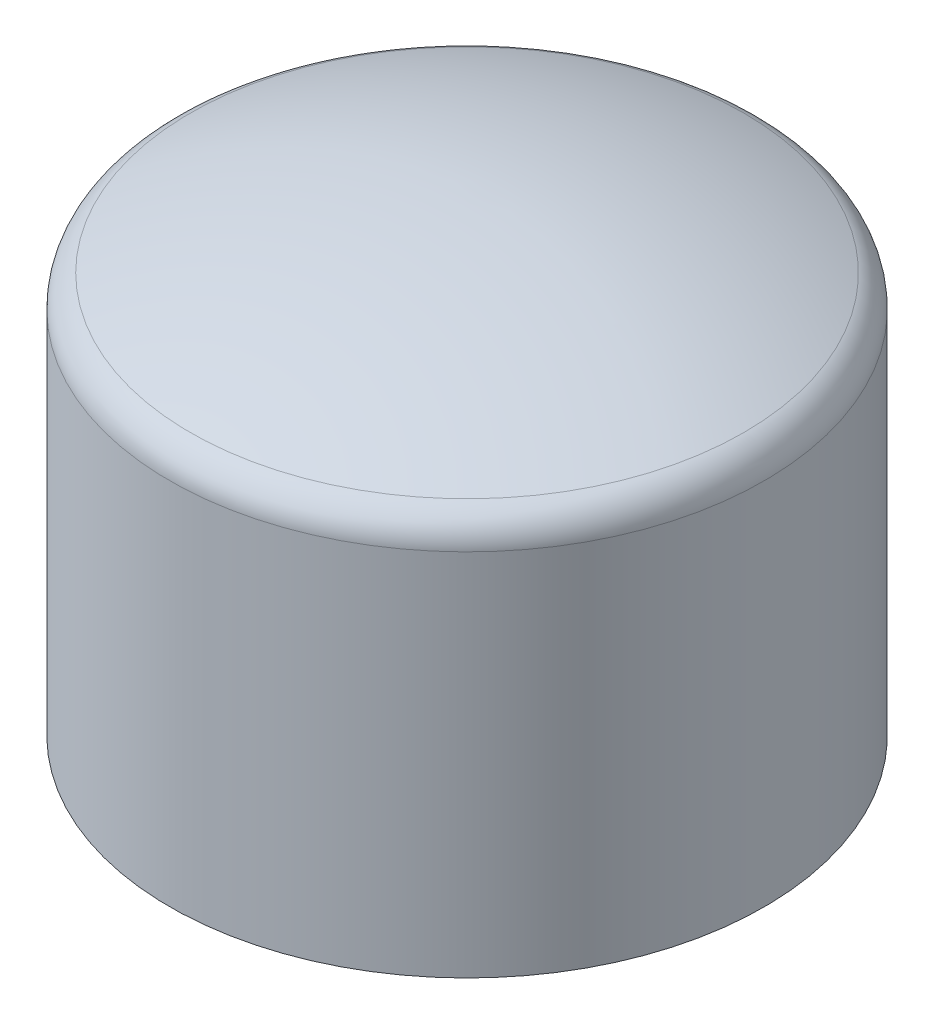
ISO-10303-21;
HEADER;
FILE_DESCRIPTION(('STEP AP214'),'2;1');
FILE_NAME('part.step','',(''),(''),'','','');
FILE_SCHEMA(('AUTOMOTIVE_DESIGN { 1 0 10303 214 1 1 1 1 }'));
ENDSEC;
DATA;
#1=APPLICATION_CONTEXT('core data for automotive mechanical design processes');
#2=APPLICATION_PROTOCOL_DEFINITION('international standard','automotive_design',2000,#1);
#3=PRODUCT_CONTEXT('',#1,'mechanical');
#4=PRODUCT('Part','Part','',(#3));
#5=PRODUCT_RELATED_PRODUCT_CATEGORY('part','',(#4));
#6=PRODUCT_DEFINITION_FORMATION('','',#4);
#7=PRODUCT_DEFINITION_CONTEXT('part definition',#1,'design');
#8=PRODUCT_DEFINITION('design','',#6,#7);
#9=PRODUCT_DEFINITION_SHAPE('','',#8);
#10=(LENGTH_UNIT() NAMED_UNIT(*) SI_UNIT(.MILLI.,.METRE.));
#11=(NAMED_UNIT(*) PLANE_ANGLE_UNIT() SI_UNIT($,.RADIAN.));
#12=(NAMED_UNIT(*) SI_UNIT($,.STERADIAN.) SOLID_ANGLE_UNIT());
#13=UNCERTAINTY_MEASURE_WITH_UNIT(LENGTH_MEASURE(1.E-05),#10,'distance_accuracy_value','');
#14=(GEOMETRIC_REPRESENTATION_CONTEXT(3) GLOBAL_UNCERTAINTY_ASSIGNED_CONTEXT((#13)) GLOBAL_UNIT_ASSIGNED_CONTEXT((#10,
#11,#12)) REPRESENTATION_CONTEXT('',''));
#15=CARTESIAN_POINT('',(0.,0.,0.));
#16=DIRECTION('',(0.,0.,1.));
#17=DIRECTION('',(1.,0.,0.));
#18=AXIS2_PLACEMENT_3D('',#15,#16,#17);
#19=CARTESIAN_POINT('',(0.,0.,0.));
#20=DIRECTION('',(0.,-1.,0.));
#21=DIRECTION('',(0.,0.,-1.));
#22=AXIS2_PLACEMENT_3D('',#19,#20,#21);
#23=CYLINDRICAL_SURFACE('',#22,16.7005);
#24=CARTESIAN_POINT('',(0.,23.6480643894147,0.));
#25=DIRECTION('',(0.,-1.,0.));
#26=DIRECTION('',(0.,0.,-1.));
#27=AXIS2_PLACEMENT_3D('',#24,#25,#26);
#28=CIRCLE('',#27,16.7005);
#29=CARTESIAN_POINT('',(0.,23.6480643894147,-16.7005));
#30=VERTEX_POINT('',#29);
#31=EDGE_CURVE('E54',#30,#30,#28,.F.);
#32=ORIENTED_EDGE('',*,*,#31,.T.);
#33=EDGE_LOOP('',(#32));
#34=FACE_BOUND('',#33,.T.);
#35=CARTESIAN_POINT('',(0.,0.,0.));
#36=DIRECTION('',(0.,-1.,0.));
#37=DIRECTION('',(0.,0.,-1.));
#38=AXIS2_PLACEMENT_3D('',#35,#36,#37);
#39=CIRCLE('',#38,16.7005);
#40=CARTESIAN_POINT('',(0.,0.,-16.7005));
#41=VERTEX_POINT('',#40);
#42=EDGE_CURVE('E65',#41,#41,#39,.T.);
#43=ORIENTED_EDGE('',*,*,#42,.T.);
#44=EDGE_LOOP('',(#43));
#45=FACE_BOUND('',#44,.T.);
#46=ADVANCED_FACE('F41',(#34,#45),#23,.F.);
#47=CARTESIAN_POINT('',(16.7005,0.,0.));
#48=DIRECTION('',(0.,-1.,0.));
#49=DIRECTION('',(0.,0.,-1.));
#50=AXIS2_PLACEMENT_3D('',#47,#48,#49);
#51=PLANE('',#50);
#52=CARTESIAN_POINT('',(0.,0.,0.));
#53=DIRECTION('',(0.,-1.,0.));
#54=DIRECTION('',(0.,0.,-1.));
#55=AXIS2_PLACEMENT_3D('',#52,#53,#54);
#56=CIRCLE('',#55,21.844);
#57=CARTESIAN_POINT('',(0.,0.,-21.844));
#58=VERTEX_POINT('',#57);
#59=EDGE_CURVE('E69',#58,#58,#56,.T.);
#60=ORIENTED_EDGE('',*,*,#59,.T.);
#61=EDGE_LOOP('',(#60));
#62=FACE_BOUND('',#61,.T.);
#63=ORIENTED_EDGE('',*,*,#42,.F.);
#64=EDGE_LOOP('',(#63));
#65=FACE_BOUND('',#64,.T.);
#66=ADVANCED_FACE('F74',(#62,#65),#51,.T.);
#67=CARTESIAN_POINT('',(0.,0.,0.));
#68=DIRECTION('',(0.,-1.,0.));
#69=DIRECTION('',(0.,0.,-1.));
#70=AXIS2_PLACEMENT_3D('',#67,#68,#69);
#71=CYLINDRICAL_SURFACE('',#70,21.844);
#72=CARTESIAN_POINT('',(0.,27.1220005959963,0.));
#73=DIRECTION('',(0.,-1.,0.));
#74=DIRECTION('',(0.,0.,-1.));
#75=AXIS2_PLACEMENT_3D('',#72,#73,#74);
#76=CIRCLE('',#75,21.844);
#77=CARTESIAN_POINT('',(0.,27.1220005959963,-21.844));
#78=VERTEX_POINT('',#77);
#79=EDGE_CURVE('E49',#78,#78,#76,.T.);
#80=ORIENTED_EDGE('',*,*,#79,.T.);
#81=EDGE_LOOP('',(#80));
#82=FACE_BOUND('',#81,.T.);
#83=ORIENTED_EDGE('',*,*,#59,.F.);
#84=EDGE_LOOP('',(#83));
#85=FACE_BOUND('',#84,.T.);
#86=ADVANCED_FACE('F77',(#82,#85),#71,.T.);
#87=CARTESIAN_POINT('',(0.,-16.0418431372549,0.));
#88=DIRECTION('',(0.,-1.,0.));
#89=DIRECTION('',(1.,0.,0.));
#90=AXIS2_PLACEMENT_3D('',#87,#88,#89);
#91=SPHERICAL_SURFACE('',#90,49.8238431372549);
#92=CARTESIAN_POINT('',(0.,29.4406819003946,0.));
#93=DIRECTION('',(0.,-1.,0.));
#94=DIRECTION('',(0.,0.,-1.));
#95=AXIS2_PLACEMENT_3D('',#92,#93,#94);
#96=CIRCLE('',#95,20.3409749315357);
#97=CARTESIAN_POINT('',(0.,29.4406819003946,-20.3409749315357));
#98=VERTEX_POINT('',#97);
#99=EDGE_CURVE('E10',#98,#98,#96,.F.);
#100=ORIENTED_EDGE('',*,*,#99,.T.);
#101=EDGE_LOOP('',(#100));
#102=FACE_BOUND('',#101,.T.);
#103=ADVANCED_FACE('F79',(#102),#91,.T.);
#104=CARTESIAN_POINT('',(0.,-16.0418431372549,0.));
#105=DIRECTION('',(0.,-1.,0.));
#106=DIRECTION('',(1.,0.,0.));
#107=AXIS2_PLACEMENT_3D('',#104,#105,#106);
#108=SPHERICAL_SURFACE('',#107,44.6803431372549);
#109=CARTESIAN_POINT('',(0.,26.0403649169493,0.));
#110=DIRECTION('',(0.,-1.,0.));
#111=DIRECTION('',(0.,0.,-1.));
#112=AXIS2_PLACEMENT_3D('',#109,#110,#111);
#113=CIRCLE('',#112,15.014021051854);
#114=CARTESIAN_POINT('',(0.,26.0403649169493,-15.014021051854));
#115=VERTEX_POINT('',#114);
#116=EDGE_CURVE('E59',#115,#115,#113,.T.);
#117=ORIENTED_EDGE('',*,*,#116,.T.);
#118=EDGE_LOOP('',(#117));
#119=FACE_BOUND('',#118,.T.);
#120=ADVANCED_FACE('F85',(#119),#108,.F.);
#121=CARTESIAN_POINT('',(0.,23.6480643894147,0.));
#122=DIRECTION('',(0.,-1.,0.));
#123=DIRECTION('',(0.,0.,-1.));
#124=AXIS2_PLACEMENT_3D('',#121,#122,#123);
#125=TOROIDAL_SURFACE('',#124,14.1605,2.54);
#126=ORIENTED_EDGE('',*,*,#31,.F.);
#127=EDGE_LOOP('',(#126));
#128=FACE_BOUND('',#127,.T.);
#129=ORIENTED_EDGE('',*,*,#116,.F.);
#130=EDGE_LOOP('',(#129));
#131=FACE_BOUND('',#130,.T.);
#132=ADVANCED_FACE('F94',(#128,#131),#125,.F.);
#133=CARTESIAN_POINT('',(0.,27.1220005959963,0.));
#134=DIRECTION('',(0.,-1.,0.));
#135=DIRECTION('',(0.,0.,-1.));
#136=AXIS2_PLACEMENT_3D('',#133,#134,#135);
#137=TOROIDAL_SURFACE('',#136,19.304,2.54);
#138=ORIENTED_EDGE('',*,*,#99,.F.);
#139=EDGE_LOOP('',(#138));
#140=FACE_BOUND('',#139,.T.);
#141=ORIENTED_EDGE('',*,*,#79,.F.);
#142=EDGE_LOOP('',(#141));
#143=FACE_BOUND('',#142,.T.);
#144=ADVANCED_FACE('F43',(#140,#143),#137,.T.);
#145=CLOSED_SHELL('',(#46,#66,#86,#103,#120,#132,#144));
#146=MANIFOLD_SOLID_BREP('B2',#145);
#147=ADVANCED_BREP_SHAPE_REPRESENTATION('',(#18,#146),#14);
#148=SHAPE_DEFINITION_REPRESENTATION(#9,#147);
ENDSEC;
END-ISO-10303-21;
